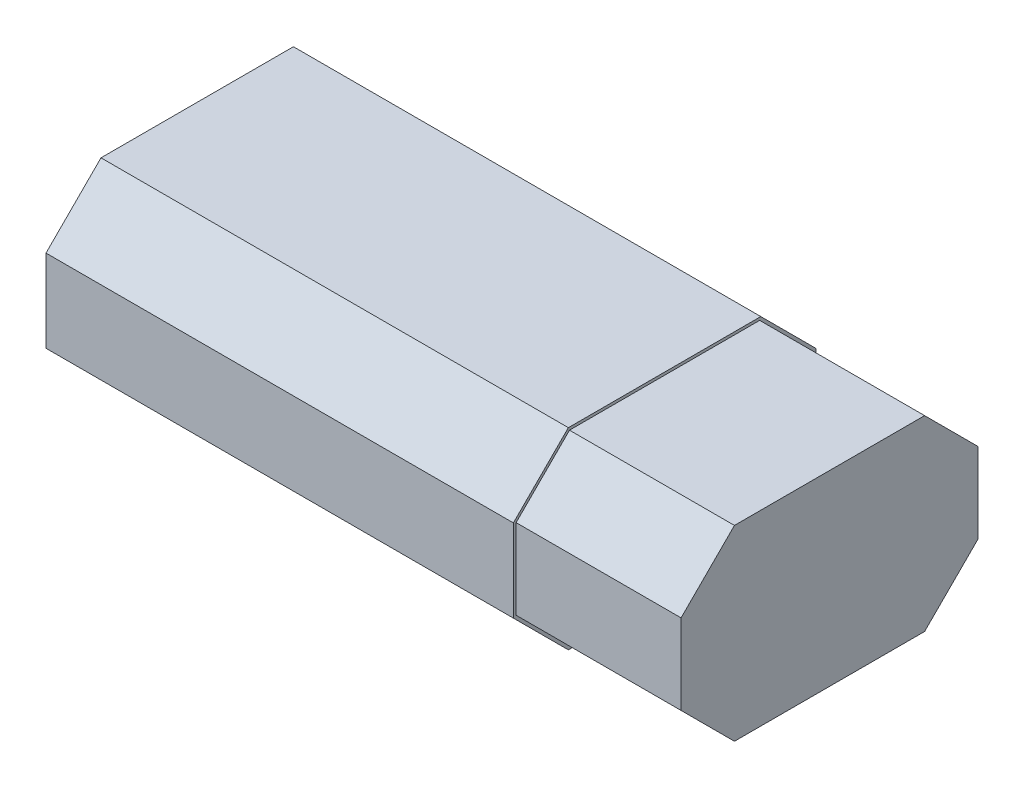
ISO-10303-21;
HEADER;
FILE_DESCRIPTION(('STEP AP214'),'2;1');
FILE_NAME('part.step','',(''),(''),'','','');
FILE_SCHEMA(('AUTOMOTIVE_DESIGN { 1 0 10303 214 1 1 1 1 }'));
ENDSEC;
DATA;
#1=APPLICATION_CONTEXT('core data for automotive mechanical design processes');
#2=APPLICATION_PROTOCOL_DEFINITION('international standard','automotive_design',2000,#1);
#3=PRODUCT_CONTEXT('',#1,'mechanical');
#4=PRODUCT('Part','Part','',(#3));
#5=PRODUCT_RELATED_PRODUCT_CATEGORY('part','',(#4));
#6=PRODUCT_DEFINITION_FORMATION('','',#4);
#7=PRODUCT_DEFINITION_CONTEXT('part definition',#1,'design');
#8=PRODUCT_DEFINITION('design','',#6,#7);
#9=PRODUCT_DEFINITION_SHAPE('','',#8);
#10=(LENGTH_UNIT() NAMED_UNIT(*) SI_UNIT(.MILLI.,.METRE.));
#11=(NAMED_UNIT(*) PLANE_ANGLE_UNIT() SI_UNIT($,.RADIAN.));
#12=(NAMED_UNIT(*) SI_UNIT($,.STERADIAN.) SOLID_ANGLE_UNIT());
#13=UNCERTAINTY_MEASURE_WITH_UNIT(LENGTH_MEASURE(1.E-05),#10,'distance_accuracy_value','');
#14=(GEOMETRIC_REPRESENTATION_CONTEXT(3) GLOBAL_UNCERTAINTY_ASSIGNED_CONTEXT((#13)) GLOBAL_UNIT_ASSIGNED_CONTEXT((#10,
#11,#12)) REPRESENTATION_CONTEXT('',''));
#15=CARTESIAN_POINT('',(0.,0.,0.));
#16=DIRECTION('',(0.,0.,1.));
#17=DIRECTION('',(1.,0.,0.));
#18=AXIS2_PLACEMENT_3D('',#15,#16,#17);
#19=CARTESIAN_POINT('',(115.,17.5,-17.5));
#20=DIRECTION('',(0.,-1.,0.));
#21=DIRECTION('',(0.,0.,-1.));
#22=AXIS2_PLACEMENT_3D('',#19,#20,#21);
#23=PLANE('',#22);
#24=DIRECTION('',(0.,0.,1.));
#25=VECTOR('',#24,1.);
#26=CARTESIAN_POINT('',(85.,17.5,-17.5));
#27=LINE('',#26,#25);
#28=CARTESIAN_POINT('',(85.,17.5,-17.5));
#29=VERTEX_POINT('',#28);
#30=CARTESIAN_POINT('',(85.,17.5,17.5));
#31=VERTEX_POINT('',#30);
#32=EDGE_CURVE('E255',#29,#31,#27,.T.);
#33=ORIENTED_EDGE('',*,*,#32,.F.);
#34=DIRECTION('',(-1.,0.,0.));
#35=VECTOR('',#34,1.);
#36=CARTESIAN_POINT('',(115.,17.5,-17.5));
#37=LINE('',#36,#35);
#38=CARTESIAN_POINT('',(0.,17.5,-17.5));
#39=VERTEX_POINT('',#38);
#40=EDGE_CURVE('E305',#29,#39,#37,.T.);
#41=ORIENTED_EDGE('',*,*,#40,.T.);
#42=DIRECTION('',(0.,0.,1.));
#43=VECTOR('',#42,1.);
#44=CARTESIAN_POINT('',(0.,17.5,-17.5));
#45=LINE('',#44,#43);
#46=CARTESIAN_POINT('',(0.,17.5,17.5));
#47=VERTEX_POINT('',#46);
#48=EDGE_CURVE('E273',#39,#47,#45,.T.);
#49=ORIENTED_EDGE('',*,*,#48,.T.);
#50=DIRECTION('',(-1.,0.,0.));
#51=VECTOR('',#50,1.);
#52=CARTESIAN_POINT('',(115.,17.5,17.5));
#53=LINE('',#52,#51);
#54=EDGE_CURVE('E11',#31,#47,#53,.T.);
#55=ORIENTED_EDGE('',*,*,#54,.F.);
#56=EDGE_LOOP('',(#33,#41,#49,#55));
#57=FACE_BOUND('',#56,.T.);
#58=ADVANCED_FACE('F41',(#57),#23,.F.);
#59=CARTESIAN_POINT('',(115.,17.5,17.5));
#60=DIRECTION('',(0.,-0.707106781186548,-0.707106781186548));
#61=DIRECTION('',(0.,0.707106781186548,-0.707106781186547));
#62=AXIS2_PLACEMENT_3D('',#59,#60,#61);
#63=PLANE('',#62);
#64=DIRECTION('',(0.,-0.707106781186547,0.707106781186547));
#65=VECTOR('',#64,1.);
#66=CARTESIAN_POINT('',(85.,17.5,17.5));
#67=LINE('',#66,#65);
#68=CARTESIAN_POINT('',(85.,7.5,27.5));
#69=VERTEX_POINT('',#68);
#70=EDGE_CURVE('E258',#31,#69,#67,.T.);
#71=ORIENTED_EDGE('',*,*,#70,.F.);
#72=ORIENTED_EDGE('',*,*,#54,.T.);
#73=DIRECTION('',(0.,-0.707106781186548,0.707106781186547));
#74=VECTOR('',#73,1.);
#75=CARTESIAN_POINT('',(0.,17.5,17.5));
#76=LINE('',#75,#74);
#77=CARTESIAN_POINT('',(0.,7.5,27.5));
#78=VERTEX_POINT('',#77);
#79=EDGE_CURVE('E277',#47,#78,#76,.T.);
#80=ORIENTED_EDGE('',*,*,#79,.T.);
#81=DIRECTION('',(-1.,0.,0.));
#82=VECTOR('',#81,1.);
#83=CARTESIAN_POINT('',(115.,7.5,27.5));
#84=LINE('',#83,#82);
#85=EDGE_CURVE('E49',#69,#78,#84,.T.);
#86=ORIENTED_EDGE('',*,*,#85,.F.);
#87=EDGE_LOOP('',(#71,#72,#80,#86));
#88=FACE_BOUND('',#87,.T.);
#89=ADVANCED_FACE('F333',(#88),#63,.F.);
#90=CARTESIAN_POINT('',(115.,7.5,27.5));
#91=DIRECTION('',(0.,0.,-1.));
#92=DIRECTION('',(0.,1.,0.));
#93=AXIS2_PLACEMENT_3D('',#90,#91,#92);
#94=PLANE('',#93);
#95=DIRECTION('',(0.,-1.,0.));
#96=VECTOR('',#95,1.);
#97=CARTESIAN_POINT('',(85.,7.5,27.5));
#98=LINE('',#97,#96);
#99=CARTESIAN_POINT('',(85.,-7.5,27.5));
#100=VERTEX_POINT('',#99);
#101=EDGE_CURVE('E261',#69,#100,#98,.T.);
#102=ORIENTED_EDGE('',*,*,#101,.F.);
#103=ORIENTED_EDGE('',*,*,#85,.T.);
#104=DIRECTION('',(0.,-1.,0.));
#105=VECTOR('',#104,1.);
#106=CARTESIAN_POINT('',(0.,7.5,27.5));
#107=LINE('',#106,#105);
#108=CARTESIAN_POINT('',(0.,-7.50000000000001,27.5));
#109=VERTEX_POINT('',#108);
#110=EDGE_CURVE('E281',#78,#109,#107,.T.);
#111=ORIENTED_EDGE('',*,*,#110,.T.);
#112=DIRECTION('',(-1.,0.,0.));
#113=VECTOR('',#112,1.);
#114=CARTESIAN_POINT('',(115.,-7.50000000000001,27.5));
#115=LINE('',#114,#113);
#116=EDGE_CURVE('E320',#100,#109,#115,.T.);
#117=ORIENTED_EDGE('',*,*,#116,.F.);
#118=EDGE_LOOP('',(#102,#103,#111,#117));
#119=FACE_BOUND('',#118,.T.);
#120=ADVANCED_FACE('F326',(#119),#94,.F.);
#121=CARTESIAN_POINT('',(115.,-17.5,17.5));
#122=DIRECTION('',(0.,0.707106781186548,-0.707106781186548));
#123=DIRECTION('',(0.,0.707106781186548,0.707106781186547));
#124=AXIS2_PLACEMENT_3D('',#121,#122,#123);
#125=PLANE('',#124);
#126=DIRECTION('',(0.,-0.707106781186547,-0.707106781186547));
#127=VECTOR('',#126,1.);
#128=CARTESIAN_POINT('',(85.,-7.5,27.5));
#129=LINE('',#128,#127);
#130=CARTESIAN_POINT('',(85.,-17.5,17.5));
#131=VERTEX_POINT('',#130);
#132=EDGE_CURVE('E264',#100,#131,#129,.T.);
#133=ORIENTED_EDGE('',*,*,#132,.F.);
#134=ORIENTED_EDGE('',*,*,#116,.T.);
#135=DIRECTION('',(0.,-0.707106781186548,-0.707106781186547));
#136=VECTOR('',#135,1.);
#137=CARTESIAN_POINT('',(0.,-17.5,17.5));
#138=LINE('',#137,#136);
#139=CARTESIAN_POINT('',(0.,-17.5,17.5));
#140=VERTEX_POINT('',#139);
#141=EDGE_CURVE('E285',#109,#140,#138,.T.);
#142=ORIENTED_EDGE('',*,*,#141,.T.);
#143=DIRECTION('',(-1.,0.,0.));
#144=VECTOR('',#143,1.);
#145=CARTESIAN_POINT('',(115.,-17.5,17.5));
#146=LINE('',#145,#144);
#147=EDGE_CURVE('E317',#131,#140,#146,.T.);
#148=ORIENTED_EDGE('',*,*,#147,.F.);
#149=EDGE_LOOP('',(#133,#134,#142,#148));
#150=FACE_BOUND('',#149,.T.);
#151=ADVANCED_FACE('F343',(#150),#125,.F.);
#152=CARTESIAN_POINT('',(115.,-17.5,-17.5));
#153=DIRECTION('',(0.,1.,0.));
#154=DIRECTION('',(0.,0.,1.));
#155=AXIS2_PLACEMENT_3D('',#152,#153,#154);
#156=PLANE('',#155);
#157=DIRECTION('',(0.,0.,-1.));
#158=VECTOR('',#157,1.);
#159=CARTESIAN_POINT('',(85.,-17.5,17.5));
#160=LINE('',#159,#158);
#161=CARTESIAN_POINT('',(85.,-17.5,-17.5));
#162=VERTEX_POINT('',#161);
#163=EDGE_CURVE('E267',#131,#162,#160,.T.);
#164=ORIENTED_EDGE('',*,*,#163,.F.);
#165=ORIENTED_EDGE('',*,*,#147,.T.);
#166=DIRECTION('',(0.,0.,-1.));
#167=VECTOR('',#166,1.);
#168=CARTESIAN_POINT('',(0.,-17.5,-17.5));
#169=LINE('',#168,#167);
#170=CARTESIAN_POINT('',(0.,-17.5,-17.5));
#171=VERTEX_POINT('',#170);
#172=EDGE_CURVE('E289',#140,#171,#169,.T.);
#173=ORIENTED_EDGE('',*,*,#172,.T.);
#174=DIRECTION('',(-1.,0.,0.));
#175=VECTOR('',#174,1.);
#176=CARTESIAN_POINT('',(115.,-17.5,-17.5));
#177=LINE('',#176,#175);
#178=EDGE_CURVE('E314',#162,#171,#177,.T.);
#179=ORIENTED_EDGE('',*,*,#178,.F.);
#180=EDGE_LOOP('',(#164,#165,#173,#179));
#181=FACE_BOUND('',#180,.T.);
#182=ADVANCED_FACE('F348',(#181),#156,.F.);
#183=CARTESIAN_POINT('',(115.,-7.5,-27.5));
#184=DIRECTION('',(0.,0.707106781186548,0.707106781186548));
#185=DIRECTION('',(0.,-0.707106781186548,0.707106781186547));
#186=AXIS2_PLACEMENT_3D('',#183,#184,#185);
#187=PLANE('',#186);
#188=DIRECTION('',(0.,0.707106781186547,-0.707106781186547));
#189=VECTOR('',#188,1.);
#190=CARTESIAN_POINT('',(85.,-17.5,-17.5));
#191=LINE('',#190,#189);
#192=CARTESIAN_POINT('',(85.,-7.5,-27.5));
#193=VERTEX_POINT('',#192);
#194=EDGE_CURVE('E270',#162,#193,#191,.T.);
#195=ORIENTED_EDGE('',*,*,#194,.F.);
#196=ORIENTED_EDGE('',*,*,#178,.T.);
#197=DIRECTION('',(0.,0.707106781186548,-0.707106781186547));
#198=VECTOR('',#197,1.);
#199=CARTESIAN_POINT('',(0.,-7.5,-27.5));
#200=LINE('',#199,#198);
#201=CARTESIAN_POINT('',(0.,-7.5,-27.5));
#202=VERTEX_POINT('',#201);
#203=EDGE_CURVE('E293',#171,#202,#200,.T.);
#204=ORIENTED_EDGE('',*,*,#203,.T.);
#205=DIRECTION('',(-1.,0.,0.));
#206=VECTOR('',#205,1.);
#207=CARTESIAN_POINT('',(115.,-7.5,-27.5));
#208=LINE('',#207,#206);
#209=EDGE_CURVE('E311',#193,#202,#208,.T.);
#210=ORIENTED_EDGE('',*,*,#209,.F.);
#211=EDGE_LOOP('',(#195,#196,#204,#210));
#212=FACE_BOUND('',#211,.T.);
#213=ADVANCED_FACE('F350',(#212),#187,.F.);
#214=CARTESIAN_POINT('',(115.,7.50000000000001,-27.5));
#215=DIRECTION('',(0.,0.,1.));
#216=DIRECTION('',(1.,0.,0.));
#217=AXIS2_PLACEMENT_3D('',#214,#215,#216);
#218=PLANE('',#217);
#219=DIRECTION('',(0.,1.,0.));
#220=VECTOR('',#219,1.);
#221=CARTESIAN_POINT('',(85.,-7.5,-27.5));
#222=LINE('',#221,#220);
#223=CARTESIAN_POINT('',(85.,7.50000000000001,-27.5));
#224=VERTEX_POINT('',#223);
#225=EDGE_CURVE('E56',#193,#224,#222,.T.);
#226=ORIENTED_EDGE('',*,*,#225,.F.);
#227=ORIENTED_EDGE('',*,*,#209,.T.);
#228=DIRECTION('',(0.,1.,0.));
#229=VECTOR('',#228,1.);
#230=CARTESIAN_POINT('',(0.,7.50000000000001,-27.5));
#231=LINE('',#230,#229);
#232=CARTESIAN_POINT('',(0.,7.50000000000001,-27.5));
#233=VERTEX_POINT('',#232);
#234=EDGE_CURVE('E297',#202,#233,#231,.T.);
#235=ORIENTED_EDGE('',*,*,#234,.T.);
#236=DIRECTION('',(-1.,0.,0.));
#237=VECTOR('',#236,1.);
#238=CARTESIAN_POINT('',(115.,7.50000000000001,-27.5));
#239=LINE('',#238,#237);
#240=EDGE_CURVE('E308',#224,#233,#239,.T.);
#241=ORIENTED_EDGE('',*,*,#240,.F.);
#242=EDGE_LOOP('',(#226,#227,#235,#241));
#243=FACE_BOUND('',#242,.T.);
#244=ADVANCED_FACE('F355',(#243),#218,.F.);
#245=CARTESIAN_POINT('',(115.,7.50000000000001,-27.5));
#246=DIRECTION('',(0.,-0.707106781186548,0.707106781186548));
#247=DIRECTION('',(0.,-0.707106781186548,-0.707106781186547));
#248=AXIS2_PLACEMENT_3D('',#245,#246,#247);
#249=PLANE('',#248);
#250=DIRECTION('',(0.,0.707106781186547,0.707106781186548));
#251=VECTOR('',#250,1.);
#252=CARTESIAN_POINT('',(85.,7.50000000000001,-27.5));
#253=LINE('',#252,#251);
#254=EDGE_CURVE('E252',#224,#29,#253,.T.);
#255=ORIENTED_EDGE('',*,*,#254,.F.);
#256=ORIENTED_EDGE('',*,*,#240,.T.);
#257=DIRECTION('',(0.,0.707106781186548,0.707106781186547));
#258=VECTOR('',#257,1.);
#259=CARTESIAN_POINT('',(0.,7.50000000000001,-27.5));
#260=LINE('',#259,#258);
#261=EDGE_CURVE('E301',#233,#39,#260,.T.);
#262=ORIENTED_EDGE('',*,*,#261,.T.);
#263=ORIENTED_EDGE('',*,*,#40,.F.);
#264=EDGE_LOOP('',(#255,#256,#262,#263));
#265=FACE_BOUND('',#264,.T.);
#266=ADVANCED_FACE('F358',(#265),#249,.F.);
#267=CARTESIAN_POINT('',(0.,0.,0.));
#268=DIRECTION('',(1.,0.,0.));
#269=DIRECTION('',(0.,0.,-1.));
#270=AXIS2_PLACEMENT_3D('',#267,#268,#269);
#271=PLANE('',#270);
#272=ORIENTED_EDGE('',*,*,#48,.F.);
#273=ORIENTED_EDGE('',*,*,#261,.F.);
#274=ORIENTED_EDGE('',*,*,#234,.F.);
#275=ORIENTED_EDGE('',*,*,#203,.F.);
#276=ORIENTED_EDGE('',*,*,#172,.F.);
#277=ORIENTED_EDGE('',*,*,#141,.F.);
#278=ORIENTED_EDGE('',*,*,#110,.F.);
#279=ORIENTED_EDGE('',*,*,#79,.F.);
#280=EDGE_LOOP('',(#272,#273,#274,#275,#276,#277,#278,#279));
#281=FACE_BOUND('',#280,.T.);
#282=ADVANCED_FACE('F337',(#281),#271,.F.);
#283=CARTESIAN_POINT('',(85.,0.,0.));
#284=DIRECTION('',(1.,0.,0.));
#285=DIRECTION('',(0.,0.,-1.));
#286=AXIS2_PLACEMENT_3D('',#283,#284,#285);
#287=PLANE('',#286);
#288=DIRECTION('',(0.,0.707106781186548,-0.707106781186547));
#289=VECTOR('',#288,1.);
#290=CARTESIAN_POINT('',(85.,-17.,-17.2928932188135));
#291=LINE('',#290,#289);
#292=CARTESIAN_POINT('',(85.,-17.,-17.2928932188135));
#293=VERTEX_POINT('',#292);
#294=CARTESIAN_POINT('',(85.,-7.29289321881345,-27.));
#295=VERTEX_POINT('',#294);
#296=EDGE_CURVE('E166',#293,#295,#291,.T.);
#297=ORIENTED_EDGE('',*,*,#296,.F.);
#298=DIRECTION('',(0.,0.,-1.));
#299=VECTOR('',#298,1.);
#300=CARTESIAN_POINT('',(85.,-17.,17.2928932188135));
#301=LINE('',#300,#299);
#302=CARTESIAN_POINT('',(85.,-17.,17.2928932188135));
#303=VERTEX_POINT('',#302);
#304=EDGE_CURVE('E203',#303,#293,#301,.T.);
#305=ORIENTED_EDGE('',*,*,#304,.F.);
#306=DIRECTION('',(0.,-0.707106781186548,-0.707106781186548));
#307=VECTOR('',#306,1.);
#308=CARTESIAN_POINT('',(85.,-7.29289321881346,27.));
#309=LINE('',#308,#307);
#310=CARTESIAN_POINT('',(85.,-7.29289321881346,27.));
#311=VERTEX_POINT('',#310);
#312=EDGE_CURVE('E199',#311,#303,#309,.T.);
#313=ORIENTED_EDGE('',*,*,#312,.F.);
#314=DIRECTION('',(0.,-1.,0.));
#315=VECTOR('',#314,1.);
#316=CARTESIAN_POINT('',(85.,7.29289321881345,27.));
#317=LINE('',#316,#315);
#318=CARTESIAN_POINT('',(85.,7.29289321881345,27.));
#319=VERTEX_POINT('',#318);
#320=EDGE_CURVE('E195',#319,#311,#317,.T.);
#321=ORIENTED_EDGE('',*,*,#320,.F.);
#322=DIRECTION('',(0.,-0.707106781186548,0.707106781186547));
#323=VECTOR('',#322,1.);
#324=CARTESIAN_POINT('',(85.,17.,17.2928932188135));
#325=LINE('',#324,#323);
#326=CARTESIAN_POINT('',(85.,17.,17.2928932188135));
#327=VERTEX_POINT('',#326);
#328=EDGE_CURVE('E191',#327,#319,#325,.T.);
#329=ORIENTED_EDGE('',*,*,#328,.F.);
#330=DIRECTION('',(0.,0.,1.));
#331=VECTOR('',#330,1.);
#332=CARTESIAN_POINT('',(85.,17.,-17.2928932188135));
#333=LINE('',#332,#331);
#334=CARTESIAN_POINT('',(85.,17.,-17.2928932188135));
#335=VERTEX_POINT('',#334);
#336=EDGE_CURVE('E176',#335,#327,#333,.T.);
#337=ORIENTED_EDGE('',*,*,#336,.F.);
#338=DIRECTION('',(0.,0.707106781186548,0.707106781186548));
#339=VECTOR('',#338,1.);
#340=CARTESIAN_POINT('',(85.,7.29289321881346,-27.));
#341=LINE('',#340,#339);
#342=CARTESIAN_POINT('',(85.,7.29289321881346,-27.));
#343=VERTEX_POINT('',#342);
#344=EDGE_CURVE('E157',#343,#335,#341,.T.);
#345=ORIENTED_EDGE('',*,*,#344,.F.);
#346=DIRECTION('',(0.,1.,0.));
#347=VECTOR('',#346,1.);
#348=CARTESIAN_POINT('',(85.,-7.29289321881345,-27.));
#349=LINE('',#348,#347);
#350=EDGE_CURVE('E172',#295,#343,#349,.T.);
#351=ORIENTED_EDGE('',*,*,#350,.F.);
#352=EDGE_LOOP('',(#297,#305,#313,#321,#329,#337,#345,#351));
#353=FACE_BOUND('',#352,.T.);
#354=ORIENTED_EDGE('',*,*,#225,.T.);
#355=ORIENTED_EDGE('',*,*,#254,.T.);
#356=ORIENTED_EDGE('',*,*,#32,.T.);
#357=ORIENTED_EDGE('',*,*,#70,.T.);
#358=ORIENTED_EDGE('',*,*,#101,.T.);
#359=ORIENTED_EDGE('',*,*,#132,.T.);
#360=ORIENTED_EDGE('',*,*,#163,.T.);
#361=ORIENTED_EDGE('',*,*,#194,.T.);
#362=EDGE_LOOP('',(#354,#355,#356,#357,#358,#359,#360,#361));
#363=FACE_BOUND('',#362,.T.);
#364=ADVANCED_FACE('F171',(#353,#363),#287,.T.);
#365=CARTESIAN_POINT('',(85.,-7.29289321881345,-27.));
#366=DIRECTION('',(0.,0.,-1.));
#367=DIRECTION('',(-1.,0.,0.));
#368=AXIS2_PLACEMENT_3D('',#365,#366,#367);
#369=PLANE('',#368);
#370=DIRECTION('',(0.,1.,0.));
#371=VECTOR('',#370,1.);
#372=CARTESIAN_POINT('',(115.,-7.29289321881345,-27.));
#373=LINE('',#372,#371);
#374=CARTESIAN_POINT('',(115.,-7.29289321881345,-27.));
#375=VERTEX_POINT('',#374);
#376=CARTESIAN_POINT('',(115.,7.29289321881346,-27.));
#377=VERTEX_POINT('',#376);
#378=EDGE_CURVE('E209',#375,#377,#373,.T.);
#379=ORIENTED_EDGE('',*,*,#378,.F.);
#380=DIRECTION('',(1.,0.,0.));
#381=VECTOR('',#380,1.);
#382=CARTESIAN_POINT('',(85.,-7.29289321881345,-27.));
#383=LINE('',#382,#381);
#384=EDGE_CURVE('E180',#295,#375,#383,.T.);
#385=ORIENTED_EDGE('',*,*,#384,.F.);
#386=ORIENTED_EDGE('',*,*,#350,.T.);
#387=DIRECTION('',(1.,0.,0.));
#388=VECTOR('',#387,1.);
#389=CARTESIAN_POINT('',(85.,7.29289321881346,-27.));
#390=LINE('',#389,#388);
#391=EDGE_CURVE('E154',#343,#377,#390,.T.);
#392=ORIENTED_EDGE('',*,*,#391,.T.);
#393=EDGE_LOOP('',(#379,#385,#386,#392));
#394=FACE_BOUND('',#393,.T.);
#395=ADVANCED_FACE('F179',(#394),#369,.T.);
#396=CARTESIAN_POINT('',(85.,-17.,-17.2928932188135));
#397=DIRECTION('',(0.,-0.707106781186547,-0.707106781186548));
#398=DIRECTION('',(0.,0.707106781186548,-0.707106781186547));
#399=AXIS2_PLACEMENT_3D('',#396,#397,#398);
#400=PLANE('',#399);
#401=DIRECTION('',(0.,0.707106781186548,-0.707106781186547));
#402=VECTOR('',#401,1.);
#403=CARTESIAN_POINT('',(115.,-17.,-17.2928932188135));
#404=LINE('',#403,#402);
#405=CARTESIAN_POINT('',(115.,-17.,-17.2928932188135));
#406=VERTEX_POINT('',#405);
#407=EDGE_CURVE('E182',#406,#375,#404,.T.);
#408=ORIENTED_EDGE('',*,*,#407,.F.);
#409=DIRECTION('',(1.,0.,0.));
#410=VECTOR('',#409,1.);
#411=CARTESIAN_POINT('',(85.,-17.,-17.2928932188135));
#412=LINE('',#411,#410);
#413=EDGE_CURVE('E233',#293,#406,#412,.T.);
#414=ORIENTED_EDGE('',*,*,#413,.F.);
#415=ORIENTED_EDGE('',*,*,#296,.T.);
#416=ORIENTED_EDGE('',*,*,#384,.T.);
#417=EDGE_LOOP('',(#408,#414,#415,#416));
#418=FACE_BOUND('',#417,.T.);
#419=ADVANCED_FACE('F391',(#418),#400,.T.);
#420=CARTESIAN_POINT('',(85.,-17.,17.2928932188135));
#421=DIRECTION('',(0.,-1.,0.));
#422=DIRECTION('',(0.,0.,-1.));
#423=AXIS2_PLACEMENT_3D('',#420,#421,#422);
#424=PLANE('',#423);
#425=DIRECTION('',(0.,0.,-1.));
#426=VECTOR('',#425,1.);
#427=CARTESIAN_POINT('',(115.,-17.,17.2928932188135));
#428=LINE('',#427,#426);
#429=CARTESIAN_POINT('',(115.,-17.,17.2928932188135));
#430=VERTEX_POINT('',#429);
#431=EDGE_CURVE('E186',#430,#406,#428,.T.);
#432=ORIENTED_EDGE('',*,*,#431,.F.);
#433=DIRECTION('',(1.,0.,0.));
#434=VECTOR('',#433,1.);
#435=CARTESIAN_POINT('',(85.,-17.,17.2928932188135));
#436=LINE('',#435,#434);
#437=EDGE_CURVE('E236',#303,#430,#436,.T.);
#438=ORIENTED_EDGE('',*,*,#437,.F.);
#439=ORIENTED_EDGE('',*,*,#304,.T.);
#440=ORIENTED_EDGE('',*,*,#413,.T.);
#441=EDGE_LOOP('',(#432,#438,#439,#440));
#442=FACE_BOUND('',#441,.T.);
#443=ADVANCED_FACE('F408',(#442),#424,.T.);
#444=CARTESIAN_POINT('',(85.,-7.29289321881346,27.));
#445=DIRECTION('',(0.,-0.707106781186547,0.707106781186547));
#446=DIRECTION('',(0.,-0.707106781186548,-0.707106781186548));
#447=AXIS2_PLACEMENT_3D('',#444,#445,#446);
#448=PLANE('',#447);
#449=DIRECTION('',(0.,-0.707106781186548,-0.707106781186548));
#450=VECTOR('',#449,1.);
#451=CARTESIAN_POINT('',(115.,-7.29289321881346,27.));
#452=LINE('',#451,#450);
#453=CARTESIAN_POINT('',(115.,-7.29289321881346,27.));
#454=VERTEX_POINT('',#453);
#455=EDGE_CURVE('E224',#454,#430,#452,.T.);
#456=ORIENTED_EDGE('',*,*,#455,.F.);
#457=DIRECTION('',(1.,0.,0.));
#458=VECTOR('',#457,1.);
#459=CARTESIAN_POINT('',(85.,-7.29289321881346,27.));
#460=LINE('',#459,#458);
#461=EDGE_CURVE('E239',#311,#454,#460,.T.);
#462=ORIENTED_EDGE('',*,*,#461,.F.);
#463=ORIENTED_EDGE('',*,*,#312,.T.);
#464=ORIENTED_EDGE('',*,*,#437,.T.);
#465=EDGE_LOOP('',(#456,#462,#463,#464));
#466=FACE_BOUND('',#465,.T.);
#467=ADVANCED_FACE('F404',(#466),#448,.T.);
#468=CARTESIAN_POINT('',(85.,7.29289321881345,27.));
#469=DIRECTION('',(0.,0.,1.));
#470=DIRECTION('',(0.,-1.,0.));
#471=AXIS2_PLACEMENT_3D('',#468,#469,#470);
#472=PLANE('',#471);
#473=DIRECTION('',(0.,-1.,0.));
#474=VECTOR('',#473,1.);
#475=CARTESIAN_POINT('',(115.,7.29289321881345,27.));
#476=LINE('',#475,#474);
#477=CARTESIAN_POINT('',(115.,7.29289321881345,27.));
#478=VERTEX_POINT('',#477);
#479=EDGE_CURVE('E220',#478,#454,#476,.T.);
#480=ORIENTED_EDGE('',*,*,#479,.F.);
#481=DIRECTION('',(1.,0.,0.));
#482=VECTOR('',#481,1.);
#483=CARTESIAN_POINT('',(85.,7.29289321881345,27.));
#484=LINE('',#483,#482);
#485=EDGE_CURVE('E242',#319,#478,#484,.T.);
#486=ORIENTED_EDGE('',*,*,#485,.F.);
#487=ORIENTED_EDGE('',*,*,#320,.T.);
#488=ORIENTED_EDGE('',*,*,#461,.T.);
#489=EDGE_LOOP('',(#480,#486,#487,#488));
#490=FACE_BOUND('',#489,.T.);
#491=ADVANCED_FACE('F400',(#490),#472,.T.);
#492=CARTESIAN_POINT('',(85.,17.,17.2928932188135));
#493=DIRECTION('',(0.,0.707106781186547,0.707106781186548));
#494=DIRECTION('',(0.,-0.707106781186548,0.707106781186547));
#495=AXIS2_PLACEMENT_3D('',#492,#493,#494);
#496=PLANE('',#495);
#497=DIRECTION('',(0.,-0.707106781186548,0.707106781186547));
#498=VECTOR('',#497,1.);
#499=CARTESIAN_POINT('',(115.,17.,17.2928932188135));
#500=LINE('',#499,#498);
#501=CARTESIAN_POINT('',(115.,17.,17.2928932188135));
#502=VERTEX_POINT('',#501);
#503=EDGE_CURVE('E216',#502,#478,#500,.T.);
#504=ORIENTED_EDGE('',*,*,#503,.F.);
#505=DIRECTION('',(1.,0.,0.));
#506=VECTOR('',#505,1.);
#507=CARTESIAN_POINT('',(85.,17.,17.2928932188135));
#508=LINE('',#507,#506);
#509=EDGE_CURVE('E245',#327,#502,#508,.T.);
#510=ORIENTED_EDGE('',*,*,#509,.F.);
#511=ORIENTED_EDGE('',*,*,#328,.T.);
#512=ORIENTED_EDGE('',*,*,#485,.T.);
#513=EDGE_LOOP('',(#504,#510,#511,#512));
#514=FACE_BOUND('',#513,.T.);
#515=ADVANCED_FACE('F397',(#514),#496,.T.);
#516=CARTESIAN_POINT('',(85.,17.,-17.2928932188135));
#517=DIRECTION('',(0.,1.,0.));
#518=DIRECTION('',(0.,0.,1.));
#519=AXIS2_PLACEMENT_3D('',#516,#517,#518);
#520=PLANE('',#519);
#521=DIRECTION('',(0.,0.,1.));
#522=VECTOR('',#521,1.);
#523=CARTESIAN_POINT('',(115.,17.,-17.2928932188135));
#524=LINE('',#523,#522);
#525=CARTESIAN_POINT('',(115.,17.,-17.2928932188135));
#526=VERTEX_POINT('',#525);
#527=EDGE_CURVE('E64',#526,#502,#524,.T.);
#528=ORIENTED_EDGE('',*,*,#527,.F.);
#529=DIRECTION('',(1.,0.,0.));
#530=VECTOR('',#529,1.);
#531=CARTESIAN_POINT('',(85.,17.,-17.2928932188135));
#532=LINE('',#531,#530);
#533=EDGE_CURVE('E165',#335,#526,#532,.T.);
#534=ORIENTED_EDGE('',*,*,#533,.F.);
#535=ORIENTED_EDGE('',*,*,#336,.T.);
#536=ORIENTED_EDGE('',*,*,#509,.T.);
#537=EDGE_LOOP('',(#528,#534,#535,#536));
#538=FACE_BOUND('',#537,.T.);
#539=ADVANCED_FACE('F394',(#538),#520,.T.);
#540=CARTESIAN_POINT('',(85.,7.29289321881346,-27.));
#541=DIRECTION('',(0.,0.707106781186547,-0.707106781186547));
#542=DIRECTION('',(0.,0.707106781186548,0.707106781186548));
#543=AXIS2_PLACEMENT_3D('',#540,#541,#542);
#544=PLANE('',#543);
#545=DIRECTION('',(0.,0.707106781186548,0.707106781186548));
#546=VECTOR('',#545,1.);
#547=CARTESIAN_POINT('',(115.,7.29289321881346,-27.));
#548=LINE('',#547,#546);
#549=EDGE_CURVE('E159',#377,#526,#548,.T.);
#550=ORIENTED_EDGE('',*,*,#549,.F.);
#551=ORIENTED_EDGE('',*,*,#391,.F.);
#552=ORIENTED_EDGE('',*,*,#344,.T.);
#553=ORIENTED_EDGE('',*,*,#533,.T.);
#554=EDGE_LOOP('',(#550,#551,#552,#553));
#555=FACE_BOUND('',#554,.T.);
#556=ADVANCED_FACE('F156',(#555),#544,.T.);
#557=CARTESIAN_POINT('',(115.,0.,0.));
#558=DIRECTION('',(1.,0.,0.));
#559=DIRECTION('',(0.,0.,-1.));
#560=AXIS2_PLACEMENT_3D('',#557,#558,#559);
#561=PLANE('',#560);
#562=ORIENTED_EDGE('',*,*,#407,.T.);
#563=ORIENTED_EDGE('',*,*,#378,.T.);
#564=ORIENTED_EDGE('',*,*,#549,.T.);
#565=ORIENTED_EDGE('',*,*,#527,.T.);
#566=ORIENTED_EDGE('',*,*,#503,.T.);
#567=ORIENTED_EDGE('',*,*,#479,.T.);
#568=ORIENTED_EDGE('',*,*,#455,.T.);
#569=ORIENTED_EDGE('',*,*,#431,.T.);
#570=EDGE_LOOP('',(#562,#563,#564,#565,#566,#567,#568,#569));
#571=FACE_BOUND('',#570,.T.);
#572=ADVANCED_FACE('F383',(#571),#561,.T.);
#573=CLOSED_SHELL('',(#58,#89,#120,#151,#182,#213,#244,#266,#282,#364,#395,#419,#443,#467,#491,
#515,#539,#556,#572));
#574=MANIFOLD_SOLID_BREP('B2',#573);
#575=ADVANCED_BREP_SHAPE_REPRESENTATION('',(#18,#574),#14);
#576=SHAPE_DEFINITION_REPRESENTATION(#9,#575);
ENDSEC;
END-ISO-10303-21;
